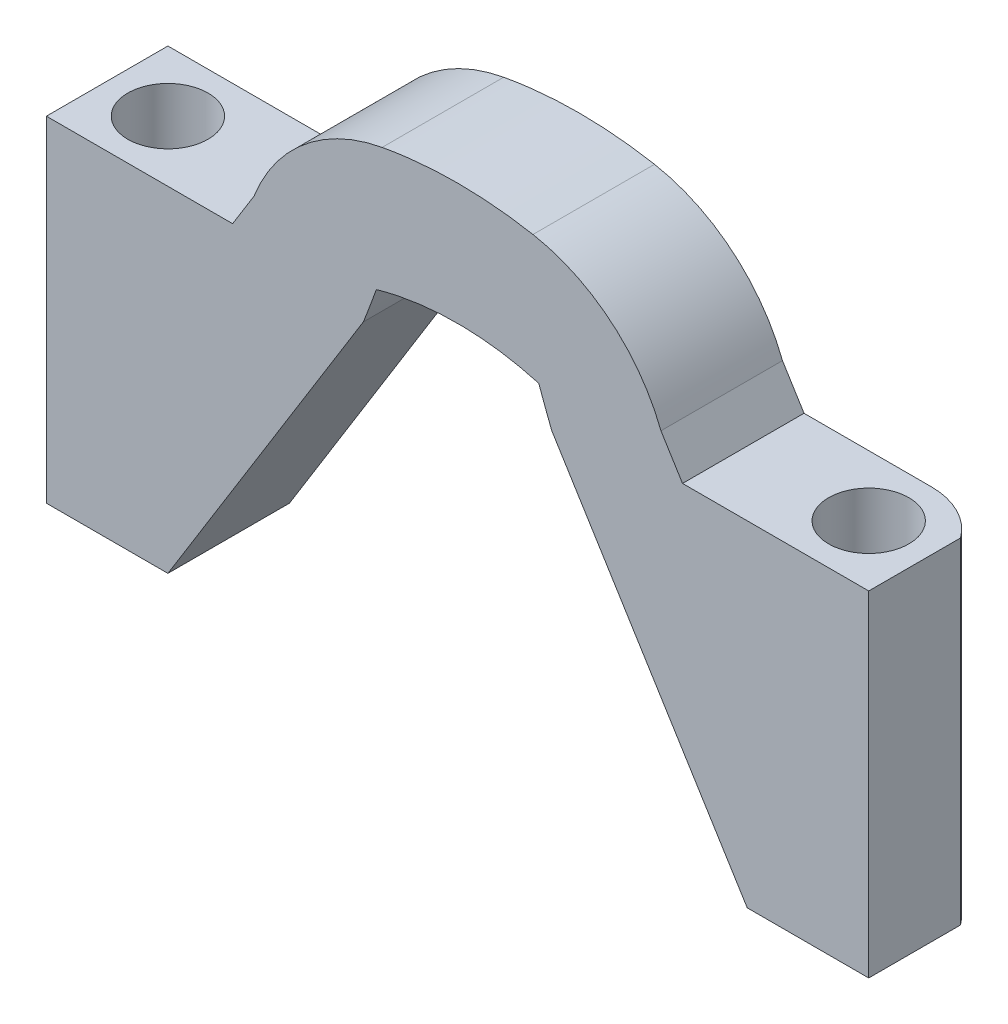
ISO-10303-21;
HEADER;
FILE_DESCRIPTION(('STEP AP214'),'2;1');
FILE_NAME('part.step','',(''),(''),'','','');
FILE_SCHEMA(('AUTOMOTIVE_DESIGN { 1 0 10303 214 1 1 1 1 }'));
ENDSEC;
DATA;
#1=APPLICATION_CONTEXT('core data for automotive mechanical design processes');
#2=APPLICATION_PROTOCOL_DEFINITION('international standard','automotive_design',2000,#1);
#3=PRODUCT_CONTEXT('',#1,'mechanical');
#4=PRODUCT('Part','Part','',(#3));
#5=PRODUCT_RELATED_PRODUCT_CATEGORY('part','',(#4));
#6=PRODUCT_DEFINITION_FORMATION('','',#4);
#7=PRODUCT_DEFINITION_CONTEXT('part definition',#1,'design');
#8=PRODUCT_DEFINITION('design','',#6,#7);
#9=PRODUCT_DEFINITION_SHAPE('','',#8);
#10=(LENGTH_UNIT() NAMED_UNIT(*) SI_UNIT(.MILLI.,.METRE.));
#11=(NAMED_UNIT(*) PLANE_ANGLE_UNIT() SI_UNIT($,.RADIAN.));
#12=(NAMED_UNIT(*) SI_UNIT($,.STERADIAN.) SOLID_ANGLE_UNIT());
#13=UNCERTAINTY_MEASURE_WITH_UNIT(LENGTH_MEASURE(1.E-05),#10,'distance_accuracy_value','');
#14=(GEOMETRIC_REPRESENTATION_CONTEXT(3) GLOBAL_UNCERTAINTY_ASSIGNED_CONTEXT((#13)) GLOBAL_UNIT_ASSIGNED_CONTEXT((#10,
#11,#12)) REPRESENTATION_CONTEXT('',''));
#15=CARTESIAN_POINT('',(0.,0.,0.));
#16=DIRECTION('',(0.,0.,1.));
#17=DIRECTION('',(1.,0.,0.));
#18=AXIS2_PLACEMENT_3D('',#15,#16,#17);
#19=CARTESIAN_POINT('',(15.520816454,38.340282351,6.988801204));
#20=DIRECTION('',(0.,0.,1.));
#21=DIRECTION('',(1.,0.,0.));
#22=AXIS2_PLACEMENT_3D('',#19,#20,#21);
#23=CYLINDRICAL_SURFACE('',#22,7.);
#24=CARTESIAN_POINT('',(15.520816454,38.340282351,4.488801204));
#25=DIRECTION('',(0.,0.,-1.));
#26=DIRECTION('',(1.,0.,0.));
#27=AXIS2_PLACEMENT_3D('',#24,#25,#26);
#28=CIRCLE('',#27,7.);
#29=CARTESIAN_POINT('',(16.785029478,45.225176354,4.488801204));
#30=VERTEX_POINT('',#29);
#31=CARTESIAN_POINT('',(22.050755304,40.862166293,4.488801204));
#32=VERTEX_POINT('',#31);
#33=EDGE_CURVE('E219',#30,#32,#28,.T.);
#34=ORIENTED_EDGE('',*,*,#33,.F.);
#35=DIRECTION('',(0.,0.,-1.));
#36=VECTOR('',#35,1.);
#37=CARTESIAN_POINT('',(16.785029478,45.225176354,9.488801204));
#38=LINE('',#37,#36);
#39=CARTESIAN_POINT('',(16.785029478,45.225176354,9.488801204));
#40=VERTEX_POINT('',#39);
#41=EDGE_CURVE('E64',#40,#30,#38,.T.);
#42=ORIENTED_EDGE('',*,*,#41,.F.);
#43=CARTESIAN_POINT('',(15.520816454,38.340282351,9.488801204));
#44=DIRECTION('',(0.,0.,1.));
#45=DIRECTION('',(1.,0.,0.));
#46=AXIS2_PLACEMENT_3D('',#43,#44,#45);
#47=CIRCLE('',#46,7.);
#48=CARTESIAN_POINT('',(22.050755304,40.862166293,9.488801204));
#49=VERTEX_POINT('',#48);
#50=EDGE_CURVE('E216',#49,#40,#47,.T.);
#51=ORIENTED_EDGE('',*,*,#50,.F.);
#52=DIRECTION('',(0.,0.,1.));
#53=VECTOR('',#52,1.);
#54=CARTESIAN_POINT('',(22.050755304,40.862166293,4.488801204));
#55=LINE('',#54,#53);
#56=EDGE_CURVE('E11',#32,#49,#55,.T.);
#57=ORIENTED_EDGE('',*,*,#56,.F.);
#58=EDGE_LOOP('',(#34,#42,#51,#57));
#59=FACE_BOUND('',#58,.T.);
#60=ADVANCED_FACE('F55',(#59),#23,.T.);
#61=CARTESIAN_POINT('',(11.84217956,38.340282284,6.988801204));
#62=DIRECTION('',(0.,0.,1.));
#63=DIRECTION('',(1.,0.,0.));
#64=AXIS2_PLACEMENT_3D('',#61,#62,#63);
#65=CYLINDRICAL_SURFACE('',#64,7.);
#66=CARTESIAN_POINT('',(11.84217956,38.340282284,4.488801204));
#67=DIRECTION('',(0.,0.,-1.));
#68=DIRECTION('',(1.,0.,0.));
#69=AXIS2_PLACEMENT_3D('',#66,#67,#68);
#70=CIRCLE('',#69,7.);
#71=CARTESIAN_POINT('',(5.31227635,40.862258507,4.488801204));
#72=VERTEX_POINT('',#71);
#73=CARTESIAN_POINT('',(10.577966277,45.225176239,4.488801204));
#74=VERTEX_POINT('',#73);
#75=EDGE_CURVE('E312',#72,#74,#70,.T.);
#76=ORIENTED_EDGE('',*,*,#75,.F.);
#77=DIRECTION('',(0.,0.,1.));
#78=VECTOR('',#77,1.);
#79=CARTESIAN_POINT('',(5.31227635,40.862258507,4.488801204));
#80=LINE('',#79,#78);
#81=CARTESIAN_POINT('',(5.31227635,40.862258507,9.488801204));
#82=VERTEX_POINT('',#81);
#83=EDGE_CURVE('E337',#72,#82,#80,.T.);
#84=ORIENTED_EDGE('',*,*,#83,.T.);
#85=CARTESIAN_POINT('',(11.84217956,38.340282284,9.488801204));
#86=DIRECTION('',(0.,0.,1.));
#87=DIRECTION('',(1.,0.,0.));
#88=AXIS2_PLACEMENT_3D('',#85,#86,#87);
#89=CIRCLE('',#88,7.);
#90=CARTESIAN_POINT('',(10.577966277,45.225176239,9.488801204));
#91=VERTEX_POINT('',#90);
#92=EDGE_CURVE('E241',#91,#82,#89,.T.);
#93=ORIENTED_EDGE('',*,*,#92,.F.);
#94=DIRECTION('',(0.,0.,1.));
#95=VECTOR('',#94,1.);
#96=CARTESIAN_POINT('',(10.577966277,45.225176239,4.488801204));
#97=LINE('',#96,#95);
#98=EDGE_CURVE('E225',#74,#91,#97,.T.);
#99=ORIENTED_EDGE('',*,*,#98,.F.);
#100=EDGE_LOOP('',(#76,#84,#93,#99));
#101=FACE_BOUND('',#100,.T.);
#102=ADVANCED_FACE('F505',(#101),#65,.T.);
#103=CARTESIAN_POINT('',(22.494258966,40.146225993,-0.511198796));
#104=DIRECTION('',(-0.85010434363712,-0.526614284775206,0.));
#105=DIRECTION('',(-0.526614284775206,0.85010434363712,0.));
#106=AXIS2_PLACEMENT_3D('',#103,#104,#105);
#107=PLANE('',#106);
#108=ORIENTED_EDGE('',*,*,#56,.T.);
#109=DIRECTION('',(0.526614284775206,-0.85010434363712,0.));
#110=VECTOR('',#109,1.);
#111=CARTESIAN_POINT('',(22.050755304,40.862166293,9.488801204));
#112=LINE('',#111,#110);
#113=CARTESIAN_POINT('',(22.937762628,39.430285692,9.488801204));
#114=VERTEX_POINT('',#113);
#115=EDGE_CURVE('E234',#49,#114,#112,.T.);
#116=ORIENTED_EDGE('',*,*,#115,.T.);
#117=DIRECTION('',(0.,0.,1.));
#118=VECTOR('',#117,1.);
#119=CARTESIAN_POINT('',(22.937762628,39.430285692,4.488801204));
#120=LINE('',#119,#118);
#121=CARTESIAN_POINT('',(22.937762628,39.430285692,4.488801204));
#122=VERTEX_POINT('',#121);
#123=EDGE_CURVE('E338',#122,#114,#120,.T.);
#124=ORIENTED_EDGE('',*,*,#123,.F.);
#125=DIRECTION('',(0.526614284775206,-0.85010434363712,0.));
#126=VECTOR('',#125,1.);
#127=CARTESIAN_POINT('',(22.050755304,40.862166293,4.488801204));
#128=LINE('',#127,#126);
#129=EDGE_CURVE('E313',#32,#122,#128,.T.);
#130=ORIENTED_EDGE('',*,*,#129,.F.);
#131=EDGE_LOOP('',(#108,#116,#124,#130));
#132=FACE_BOUND('',#131,.T.);
#133=ADVANCED_FACE('F498',(#132),#107,.F.);
#134=CARTESIAN_POINT('',(16.785029478,45.225176354,4.488801204));
#135=CARTESIAN_POINT('',(16.785029478,45.225176354,9.488801204));
#136=CARTESIAN_POINT('',(16.468142402,45.283363563,4.488801204));
#137=CARTESIAN_POINT('',(16.468142402,45.283363563,9.488801204));
#138=CARTESIAN_POINT('',(15.797495063,45.386800618,4.488801204));
#139=CARTESIAN_POINT('',(15.797495063,45.386800618,9.488801204));
#140=CARTESIAN_POINT('',(14.75986623,45.48476329,4.488801204));
#141=CARTESIAN_POINT('',(14.75986623,45.48476329,9.488801204));
#142=CARTESIAN_POINT('',(13.681498191,45.518517114,4.488801204));
#143=CARTESIAN_POINT('',(13.681498191,45.518517114,9.488801204));
#144=CARTESIAN_POINT('',(12.603130152,45.48476329,4.488801204));
#145=CARTESIAN_POINT('',(12.603130152,45.48476329,9.488801204));
#146=CARTESIAN_POINT('',(11.565501105,45.386800597,4.488801204));
#147=CARTESIAN_POINT('',(11.565501105,45.386800597,9.488801204));
#148=CARTESIAN_POINT('',(10.894853557,45.283363498,4.488801204));
#149=CARTESIAN_POINT('',(10.894853557,45.283363498,9.488801204));
#150=CARTESIAN_POINT('',(10.577966273,45.225176238,4.488801204));
#151=CARTESIAN_POINT('',(10.577966273,45.225176238,9.488801204));
#152=(BOUNDED_SURFACE() B_SPLINE_SURFACE(3,1,((#134,#135),(#136,#137),(#138,#139),(#140,#141),
(#142,#143),(#144,#145),(#146,#147),(#148,#149),(#150,#151)),.UNSPECIFIED.,.F.,.F.,
.F.) B_SPLINE_SURFACE_WITH_KNOTS((4,1,1,1,1,1,4),(2,2),(0.174149348,0.275401242,0.387700621,0.5,
0.612299379,0.724598758,0.82585072),(0.5,1.),
.UNSPECIFIED.) GEOMETRIC_REPRESENTATION_ITEM() RATIONAL_B_SPLINE_SURFACE(((1.,1.),(1.,1.),(1.,
1.),(1.,1.),(1.,1.),(1.,1.),(1.,1.),(1.,1.),(1.,1.))) REPRESENTATION_ITEM('') SURFACE());
#153=CARTESIAN_POINT('',(16.785029478,45.225176354,4.488801204));
#154=CARTESIAN_POINT('',(16.468142402,45.283363563,4.488801204));
#155=CARTESIAN_POINT('',(15.797495063,45.386800618,4.488801204));
#156=CARTESIAN_POINT('',(14.75986623,45.48476329,4.488801204));
#157=CARTESIAN_POINT('',(13.681498191,45.518517114,4.488801204));
#158=CARTESIAN_POINT('',(12.603130152,45.48476329,4.488801204));
#159=CARTESIAN_POINT('',(11.565501105,45.386800597,4.488801204));
#160=CARTESIAN_POINT('',(10.894853557,45.283363498,4.488801204));
#161=CARTESIAN_POINT('',(10.577966273,45.225176238,4.488801204));
#162=(BOUNDED_CURVE() B_SPLINE_CURVE(3,(#153,#154,#155,#156,#157,#158,#159,#160,#161),
.UNSPECIFIED.,.F.,.F.) B_SPLINE_CURVE_WITH_KNOTS((4,1,1,1,1,1,4),(0.174149348,0.275401242,
0.387700621,0.5,0.612299379,0.724598758,0.82585072),
.UNSPECIFIED.) CURVE() GEOMETRIC_REPRESENTATION_ITEM() RATIONAL_B_SPLINE_CURVE((1.,1.,1.,1.,1.,
1.,1.,1.,1.)) REPRESENTATION_ITEM(''));
#163=EDGE_CURVE('E479',#30,#74,#162,.T.);
#164=CARTESIAN_POINT('',(16.785029478,45.225176354,9.488801204));
#165=CARTESIAN_POINT('',(16.468142402,45.283363563,9.488801204));
#166=CARTESIAN_POINT('',(15.797495063,45.386800618,9.488801204));
#167=CARTESIAN_POINT('',(14.75986623,45.48476329,9.488801204));
#168=CARTESIAN_POINT('',(13.681498191,45.518517114,9.488801204));
#169=CARTESIAN_POINT('',(12.603130152,45.48476329,9.488801204));
#170=CARTESIAN_POINT('',(11.565501106,45.386800598,9.488801204));
#171=CARTESIAN_POINT('',(10.89485356,45.283363499,9.488801204));
#172=CARTESIAN_POINT('',(10.577966277,45.225176239,9.488801204));
#173=(BOUNDED_CURVE() B_SPLINE_CURVE(3,(#164,#165,#166,#167,#168,#169,#170,#171,#172),
.UNSPECIFIED.,.F.,.F.) B_SPLINE_CURVE_WITH_KNOTS((4,1,1,1,1,1,4),(0.174149348,0.275401242,
0.387700621,0.5,0.612299379,0.724598758,0.825850719),
.UNSPECIFIED.) CURVE() GEOMETRIC_REPRESENTATION_ITEM() RATIONAL_B_SPLINE_CURVE((1.,1.,1.,1.,1.,
1.,1.,1.,1.)) REPRESENTATION_ITEM(''));
#174=EDGE_CURVE('E231',#40,#91,#173,.T.);
#175=ORIENTED_EDGE('',*,*,#163,.T.);
#176=ORIENTED_EDGE('',*,*,#98,.T.);
#177=ORIENTED_EDGE('',*,*,#174,.F.);
#178=ORIENTED_EDGE('',*,*,#41,.T.);
#179=EDGE_LOOP('',(#175,#176,#177,#178));
#180=FACE_BOUND('',#179,.T.);
#181=ADVANCED_FACE('F238',(#180),#152,.T.);
#182=CARTESIAN_POINT('',(4.868745369,40.1462721,-0.511198796));
#183=DIRECTION('',(-0.85010500389315,0.52661321893381,0.));
#184=DIRECTION('',(0.,0.,1.));
#185=AXIS2_PLACEMENT_3D('',#182,#183,#184);
#186=PLANE('',#185);
#187=DIRECTION('',(-0.52661321893381,-0.85010500389315,0.));
#188=VECTOR('',#187,1.);
#189=CARTESIAN_POINT('',(5.31227635,40.862258507,4.488801204));
#190=LINE('',#189,#188);
#191=CARTESIAN_POINT('',(4.425214387,39.430285692,4.488801204));
#192=VERTEX_POINT('',#191);
#193=EDGE_CURVE('E308',#72,#192,#190,.T.);
#194=ORIENTED_EDGE('',*,*,#193,.T.);
#195=DIRECTION('',(0.,0.,1.));
#196=VECTOR('',#195,1.);
#197=CARTESIAN_POINT('',(4.425214387,39.430285692,4.488801204));
#198=LINE('',#197,#196);
#199=CARTESIAN_POINT('',(4.425214387,39.430285692,9.488801204));
#200=VERTEX_POINT('',#199);
#201=EDGE_CURVE('E334',#192,#200,#198,.T.);
#202=ORIENTED_EDGE('',*,*,#201,.T.);
#203=DIRECTION('',(-0.52661321893381,-0.85010500389315,0.));
#204=VECTOR('',#203,1.);
#205=CARTESIAN_POINT('',(5.31227635,40.862258507,9.488801204));
#206=LINE('',#205,#204);
#207=EDGE_CURVE('E246',#82,#200,#206,.T.);
#208=ORIENTED_EDGE('',*,*,#207,.F.);
#209=ORIENTED_EDGE('',*,*,#83,.F.);
#210=EDGE_LOOP('',(#194,#202,#208,#209));
#211=FACE_BOUND('',#210,.T.);
#212=ADVANCED_FACE('F497',(#211),#186,.T.);
#213=CARTESIAN_POINT('',(0.262885395,39.430285692,-4.511198796));
#214=DIRECTION('',(0.,1.,0.));
#215=DIRECTION('',(1.,0.,0.));
#216=AXIS2_PLACEMENT_3D('',#213,#214,#215);
#217=PLANE('',#216);
#218=CARTESIAN_POINT('',(-0.737114605,39.430285692,6.988801204));
#219=DIRECTION('',(0.,1.,0.));
#220=DIRECTION('',(0.,0.,1.));
#221=AXIS2_PLACEMENT_3D('',#218,#219,#220);
#222=CIRCLE('',#221,1.65);
#223=CARTESIAN_POINT('',(-0.737114605,39.430285692,8.638801204));
#224=VERTEX_POINT('',#223);
#225=EDGE_CURVE('E603',#224,#224,#222,.T.);
#226=ORIENTED_EDGE('',*,*,#225,.F.);
#227=EDGE_LOOP('',(#226));
#228=FACE_BOUND('',#227,.T.);
#229=DIRECTION('',(-1.,0.,0.));
#230=VECTOR('',#229,1.);
#231=CARTESIAN_POINT('',(4.425214387,39.430285692,4.488801204));
#232=LINE('',#231,#230);
#233=CARTESIAN_POINT('',(-3.237114605,39.430285692,4.488801204));
#234=VERTEX_POINT('',#233);
#235=EDGE_CURVE('E347',#192,#234,#232,.T.);
#236=ORIENTED_EDGE('',*,*,#235,.T.);
#237=DIRECTION('',(0.,0.,1.));
#238=VECTOR('',#237,1.);
#239=CARTESIAN_POINT('',(-3.237114605,39.430285692,4.488801204));
#240=LINE('',#239,#238);
#241=CARTESIAN_POINT('',(-3.237114605,39.430285692,9.488801204));
#242=VERTEX_POINT('',#241);
#243=EDGE_CURVE('E236',#234,#242,#240,.T.);
#244=ORIENTED_EDGE('',*,*,#243,.T.);
#245=DIRECTION('',(-1.,0.,0.));
#246=VECTOR('',#245,1.);
#247=CARTESIAN_POINT('',(4.425214387,39.430285692,9.488801204));
#248=LINE('',#247,#246);
#249=EDGE_CURVE('E265',#200,#242,#248,.T.);
#250=ORIENTED_EDGE('',*,*,#249,.F.);
#251=ORIENTED_EDGE('',*,*,#201,.F.);
#252=EDGE_LOOP('',(#236,#244,#250,#251));
#253=FACE_BOUND('',#252,.T.);
#254=ADVANCED_FACE('F525',(#228,#253),#217,.T.);
#255=CARTESIAN_POINT('',(27.100110987,39.430285692,-4.511198796));
#256=DIRECTION('',(0.,-1.,0.));
#257=DIRECTION('',(0.,0.,-1.));
#258=AXIS2_PLACEMENT_3D('',#255,#256,#257);
#259=PLANE('',#258);
#260=CARTESIAN_POINT('',(28.100110987,39.430285692,6.988801204));
#261=DIRECTION('',(0.,1.,0.));
#262=DIRECTION('',(0.,0.,1.));
#263=AXIS2_PLACEMENT_3D('',#260,#261,#262);
#264=CIRCLE('',#263,1.65);
#265=CARTESIAN_POINT('',(28.100110987,39.430285692,8.638801204));
#266=VERTEX_POINT('',#265);
#267=EDGE_CURVE('E253',#266,#266,#264,.T.);
#268=ORIENTED_EDGE('',*,*,#267,.F.);
#269=EDGE_LOOP('',(#268));
#270=FACE_BOUND('',#269,.T.);
#271=DIRECTION('',(1.,0.,0.));
#272=VECTOR('',#271,1.);
#273=CARTESIAN_POINT('',(22.937762628,39.430285692,4.488801204));
#274=LINE('',#273,#272);
#275=CARTESIAN_POINT('',(28.181498191,39.430285692,4.488801204));
#276=VERTEX_POINT('',#275);
#277=EDGE_CURVE('E317',#122,#276,#274,.T.);
#278=ORIENTED_EDGE('',*,*,#277,.F.);
#279=ORIENTED_EDGE('',*,*,#123,.T.);
#280=DIRECTION('',(1.,0.,0.));
#281=VECTOR('',#280,1.);
#282=CARTESIAN_POINT('',(22.937762628,39.430285692,9.488801204));
#283=LINE('',#282,#281);
#284=CARTESIAN_POINT('',(30.600110987,39.430285692,9.488801204));
#285=VERTEX_POINT('',#284);
#286=EDGE_CURVE('E261',#114,#285,#283,.T.);
#287=ORIENTED_EDGE('',*,*,#286,.T.);
#288=DIRECTION('',(0.,0.,1.));
#289=VECTOR('',#288,1.);
#290=CARTESIAN_POINT('',(30.600110987,39.430285692,5.713889336));
#291=LINE('',#290,#289);
#292=CARTESIAN_POINT('',(30.600110987,39.430285692,5.713889336));
#293=VERTEX_POINT('',#292);
#294=EDGE_CURVE('E353',#293,#285,#291,.T.);
#295=ORIENTED_EDGE('',*,*,#294,.F.);
#296=CARTESIAN_POINT('',(28.181498191,39.430285692,7.488801204));
#297=DIRECTION('',(0.,1.,0.));
#298=DIRECTION('',(0.,0.,-1.));
#299=AXIS2_PLACEMENT_3D('',#296,#297,#298);
#300=CIRCLE('',#299,3.);
#301=EDGE_CURVE('E86',#293,#276,#300,.T.);
#302=ORIENTED_EDGE('',*,*,#301,.T.);
#303=EDGE_LOOP('',(#278,#279,#287,#295,#302));
#304=FACE_BOUND('',#303,.T.);
#305=ADVANCED_FACE('F451',(#270,#304),#259,.F.);
#306=CARTESIAN_POINT('',(28.181498191,51.637887516,7.488801204));
#307=DIRECTION('',(0.,-1.,0.));
#308=DIRECTION('',(0.,0.,-1.));
#309=AXIS2_PLACEMENT_3D('',#306,#307,#308);
#310=CYLINDRICAL_SURFACE('',#309,3.);
#311=ORIENTED_EDGE('',*,*,#301,.F.);
#312=DIRECTION('',(0.,-1.,0.));
#313=VECTOR('',#312,1.);
#314=CARTESIAN_POINT('',(30.600110987,39.430285692,5.713889336));
#315=LINE('',#314,#313);
#316=CARTESIAN_POINT('',(30.600110987,25.637887516,5.713889336));
#317=VERTEX_POINT('',#316);
#318=EDGE_CURVE('E350',#293,#317,#315,.T.);
#319=ORIENTED_EDGE('',*,*,#318,.T.);
#320=CARTESIAN_POINT('',(28.181498191,25.637887516,7.488801204));
#321=DIRECTION('',(0.,-1.,0.));
#322=DIRECTION('',(0.,0.,-1.));
#323=AXIS2_PLACEMENT_3D('',#320,#321,#322);
#324=CIRCLE('',#323,3.);
#325=CARTESIAN_POINT('',(28.181498191,25.637887516,4.488801204));
#326=VERTEX_POINT('',#325);
#327=EDGE_CURVE('E76',#326,#317,#324,.T.);
#328=ORIENTED_EDGE('',*,*,#327,.F.);
#329=DIRECTION('',(0.,-1.,0.));
#330=VECTOR('',#329,1.);
#331=CARTESIAN_POINT('',(28.181498191,39.430285692,4.488801204));
#332=LINE('',#331,#330);
#333=EDGE_CURVE('E321',#276,#326,#332,.T.);
#334=ORIENTED_EDGE('',*,*,#333,.F.);
#335=EDGE_LOOP('',(#311,#319,#328,#334));
#336=FACE_BOUND('',#335,.T.);
#337=ADVANCED_FACE('F617',(#336),#310,.T.);
#338=CARTESIAN_POINT('',(21.578707997,32.129568897,-2.711198796));
#339=DIRECTION('',(-0.85010434363712,-0.526614284775206,0.));
#340=DIRECTION('',(-0.526614284775206,0.85010434363712,0.));
#341=AXIS2_PLACEMENT_3D('',#338,#339,#340);
#342=PLANE('',#341);
#343=DIRECTION('',(0.526614284775206,-0.85010434363712,0.));
#344=VECTOR('',#343,1.);
#345=CARTESIAN_POINT('',(17.557305007,38.621250278,4.488801204));
#346=LINE('',#345,#344);
#347=CARTESIAN_POINT('',(17.557305007,38.621250278,4.488801204));
#348=VERTEX_POINT('',#347);
#349=CARTESIAN_POINT('',(25.600110987,25.637887516,4.488801204));
#350=VERTEX_POINT('',#349);
#351=EDGE_CURVE('E329',#348,#350,#346,.T.);
#352=ORIENTED_EDGE('',*,*,#351,.T.);
#353=DIRECTION('',(0.,0.,1.));
#354=VECTOR('',#353,1.);
#355=CARTESIAN_POINT('',(25.600110987,25.637887516,4.488801204));
#356=LINE('',#355,#354);
#357=CARTESIAN_POINT('',(25.600110987,25.637887516,9.488801204));
#358=VERTEX_POINT('',#357);
#359=EDGE_CURVE('E364',#350,#358,#356,.T.);
#360=ORIENTED_EDGE('',*,*,#359,.T.);
#361=DIRECTION('',(0.526614284775206,-0.850104343637119,0.));
#362=VECTOR('',#361,1.);
#363=CARTESIAN_POINT('',(17.55729864,38.621260556,9.488801204));
#364=LINE('',#363,#362);
#365=CARTESIAN_POINT('',(17.5573005,38.621261708,9.488801204));
#366=VERTEX_POINT('',#365);
#367=EDGE_CURVE('E295',#366,#358,#364,.T.);
#368=ORIENTED_EDGE('',*,*,#367,.F.);
#369=DIRECTION('',(0.,0.,1.));
#370=VECTOR('',#369,1.);
#371=CARTESIAN_POINT('',(17.557305007,38.621250278,4.488801204));
#372=LINE('',#371,#370);
#373=EDGE_CURVE('E369',#348,#366,#372,.T.);
#374=ORIENTED_EDGE('',*,*,#373,.F.);
#375=EDGE_LOOP('',(#352,#360,#368,#374));
#376=FACE_BOUND('',#375,.T.);
#377=ADVANCED_FACE('F417',(#376),#342,.T.);
#378=CARTESIAN_POINT('',(5.784308116,32.129618935,-2.711198796));
#379=DIRECTION('',(-0.85010500389315,0.52661321893381,0.));
#380=DIRECTION('',(0.,0.,1.));
#381=AXIS2_PLACEMENT_3D('',#378,#379,#380);
#382=PLANE('',#381);
#383=DIRECTION('',(0.,0.,1.));
#384=VECTOR('',#383,1.);
#385=CARTESIAN_POINT('',(9.805730837,38.621350355,4.488801204));
#386=LINE('',#385,#384);
#387=CARTESIAN_POINT('',(9.805730837,38.621350355,4.488801204));
#388=VERTEX_POINT('',#387);
#389=CARTESIAN_POINT('',(9.805730837,38.621350355,9.488801204));
#390=VERTEX_POINT('',#389);
#391=EDGE_CURVE('E287',#388,#390,#386,.T.);
#392=ORIENTED_EDGE('',*,*,#391,.T.);
#393=DIRECTION('',(-0.52661321893381,-0.85010500389315,0.));
#394=VECTOR('',#393,1.);
#395=CARTESIAN_POINT('',(9.805730837,38.621350355,9.488801204));
#396=LINE('',#395,#394);
#397=CARTESIAN_POINT('',(1.762885395,25.637887516,9.488801204));
#398=VERTEX_POINT('',#397);
#399=EDGE_CURVE('E274',#390,#398,#396,.T.);
#400=ORIENTED_EDGE('',*,*,#399,.T.);
#401=DIRECTION('',(0.,0.,1.));
#402=VECTOR('',#401,1.);
#403=CARTESIAN_POINT('',(1.762885395,25.637887516,4.488801204));
#404=LINE('',#403,#402);
#405=CARTESIAN_POINT('',(1.762885395,25.637887516,4.488801204));
#406=VERTEX_POINT('',#405);
#407=EDGE_CURVE('E359',#406,#398,#404,.T.);
#408=ORIENTED_EDGE('',*,*,#407,.F.);
#409=DIRECTION('',(-0.52661321893381,-0.85010500389315,0.));
#410=VECTOR('',#409,1.);
#411=CARTESIAN_POINT('',(9.805730837,38.621350355,4.488801204));
#412=LINE('',#411,#410);
#413=EDGE_CURVE('E339',#388,#406,#412,.T.);
#414=ORIENTED_EDGE('',*,*,#413,.F.);
#415=EDGE_LOOP('',(#392,#400,#408,#414));
#416=FACE_BOUND('',#415,.T.);
#417=ADVANCED_FACE('F450',(#416),#382,.F.);
#418=CARTESIAN_POINT('',(17.023476229,40.041055037,9.488801204));
#419=CARTESIAN_POINT('',(14.824584972,40.666728109,9.488801204));
#420=CARTESIAN_POINT('',(12.53841141,40.666728109,9.488801204));
#421=CARTESIAN_POINT('',(10.339520153,40.041055037,9.488801204));
#422=CARTESIAN_POINT('',(17.023611976,40.041532114,9.473908645));
#423=CARTESIAN_POINT('',(14.824631403,40.6672306,9.473908645));
#424=CARTESIAN_POINT('',(12.538364979,40.6672306,9.473908645));
#425=CARTESIAN_POINT('',(10.339384405,40.041532114,9.473908645));
#426=CARTESIAN_POINT('',(17.039641207,40.097865906,7.70873212));
#427=CARTESIAN_POINT('',(14.830114025,40.726565327,7.70873212));
#428=CARTESIAN_POINT('',(12.532882357,40.726565327,7.70873212));
#429=CARTESIAN_POINT('',(10.323355174,40.097865906,7.70873212));
#430=CARTESIAN_POINT('',(17.047647237,40.126002628,6.036079841));
#431=CARTESIAN_POINT('',(14.832852399,40.756200909,6.036079841));
#432=CARTESIAN_POINT('',(12.530143983,40.756200909,6.036079841));
#433=CARTESIAN_POINT('',(10.315349144,40.126002628,6.036079841));
#434=CARTESIAN_POINT('',(17.04906419,40.130982425,4.48880109));
#435=CARTESIAN_POINT('',(14.833337052,40.761445983,4.48880109));
#436=CARTESIAN_POINT('',(12.52965933,40.761445983,4.48880109));
#437=CARTESIAN_POINT('',(10.313932191,40.130982425,4.48880109));
#438=(BOUNDED_SURFACE() B_SPLINE_SURFACE(3,3,((#418,#419,#420,#421),(#422,#423,#424,#425),(#426,
#427,#428,#429),(#430,#431,#432,#433),(#434,#435,#436,#437)),.UNSPECIFIED.,.F.,.F.,
.F.) B_SPLINE_SURFACE_WITH_KNOTS((4,1,4),(4,4),(0.405726384,0.406727036,0.524383554),
(0.165558331,0.834441669),
.UNSPECIFIED.) GEOMETRIC_REPRESENTATION_ITEM() RATIONAL_B_SPLINE_SURFACE(((0.976965826,
0.952099872,0.952099872,0.976965826),(0.976965826,0.952099872,0.952099872,0.976965826),
(0.976965826,0.952099872,0.952099872,0.976965826),(0.976965826,0.952099872,0.952099872,
0.976965826),(0.976965826,0.952099872,0.952099872,0.976965826))) REPRESENTATION_ITEM('') SURFACE());
#439=CARTESIAN_POINT('',(16.9849825000978,40.149028999351,4.48880120400121));
#440=CARTESIAN_POINT('',(16.9852625867054,40.1482402883393,4.6932212591399));
#441=CARTESIAN_POINT('',(16.985708992579,40.146981270749,4.89763915254858));
#442=CARTESIAN_POINT('',(16.9869324374271,40.1435315996862,5.30798371316629));
#443=CARTESIAN_POINT('',(16.9877119062339,40.1413340996591,5.51391031572807));
#444=CARTESIAN_POINT('',(16.9896011664374,40.1360117608414,5.92706902603369));
#445=CARTESIAN_POINT('',(16.9907130413306,40.1328810732778,6.13430104860999));
#446=CARTESIAN_POINT('',(16.9932666163034,40.1256968267382,6.54987419005043));
#447=CARTESIAN_POINT('',(16.9947100768463,40.1216383424558,6.75821521283321));
#448=CARTESIAN_POINT('',(16.997925775739,40.1126042585676,7.17581655294165));
#449=CARTESIAN_POINT('',(16.9996994699804,40.1076245984513,7.38507677110547));
#450=CARTESIAN_POINT('',(17.0035741550052,40.0967548106068,7.80433319135611));
#451=CARTESIAN_POINT('',(17.0056763142396,40.0908614331081,8.01432929832603));
#452=CARTESIAN_POINT('',(17.0102059472606,40.0781719559837,8.4348805191116));
#453=CARTESIAN_POINT('',(17.0126343172673,40.0713733698912,8.645435548188));
#454=CARTESIAN_POINT('',(17.01781408156,40.0568816482037,9.06693385524011));
#455=CARTESIAN_POINT('',(17.0205661141561,40.0491867452369,9.27787706462347));
#456=CARTESIAN_POINT('',(17.023476229,40.041055037,9.488801204));
#457=B_SPLINE_CURVE_WITH_KNOTS('',3,(#439,#440,#441,#442,#443,#444,#445,#446,#447,#448,#449,
#450,#451,#452,#453,#454,#455,#456),.UNSPECIFIED.,.F.,.F.,(4,2,2,2,2,2,2,2,4),(0.,
0.613264523532079,1.23108157457932,1.85285527553348,2.4780097005481,3.10598845003212,
3.73625422521628,4.36828840362394,5.00159063451336),.UNSPECIFIED.);
#458=CARTESIAN_POINT('',(17.023476229,40.041055037,9.488801204));
#459=VERTEX_POINT('',#458);
#460=CARTESIAN_POINT('',(16.9849825,40.149028999,4.488801204));
#461=VERTEX_POINT('',#460);
#462=EDGE_CURVE('E290',#459,#461,#457,.F.);
#463=CARTESIAN_POINT('',(17.0234762417802,40.0410550819153,9.48879980191225));
#464=CARTESIAN_POINT('',(14.8245849763713,40.6667281563079,9.48879980191226));
#465=CARTESIAN_POINT('',(12.5384114056287,40.6667281563079,9.48879980191226));
#466=CARTESIAN_POINT('',(10.3395201402198,40.0410550819153,9.48879980191225));
#467=(BOUNDED_CURVE() B_SPLINE_CURVE(3,(#463,#464,#465,#466),.UNSPECIFIED.,.F.,
.F.) B_SPLINE_CURVE_WITH_KNOTS((4,4),(0.165558331,0.834441669),
.UNSPECIFIED.) CURVE() GEOMETRIC_REPRESENTATION_ITEM() RATIONAL_B_SPLINE_CURVE((0.976965826,
0.952099872,0.952099872,0.976965826)) REPRESENTATION_ITEM(''));
#468=CARTESIAN_POINT('',(10.339520153,40.041055037,9.488801204));
#469=VERTEX_POINT('',#468);
#470=EDGE_CURVE('E386',#459,#469,#467,.T.);
#471=CARTESIAN_POINT('',(10.339520153,40.041055037,9.488801204));
#472=CARTESIAN_POINT('',(10.3424302635501,40.0491867564954,9.2778767094496));
#473=CARTESIAN_POINT('',(10.3451822939092,40.0568816698871,9.06693314489701));
#474=CARTESIAN_POINT('',(10.3503620551937,40.0713734066821,8.64543423712989));
#475=CARTESIAN_POINT('',(10.3527904245879,40.0781719979165,8.43487896252543));
#476=CARTESIAN_POINT('',(10.3573200570714,40.0908614807828,8.01432735661385));
#477=CARTESIAN_POINT('',(10.3594222165356,40.0967548593288,7.80433111006112));
#478=CARTESIAN_POINT('',(10.3632969024857,40.1076246459069,7.38507451258582));
#479=CARTESIAN_POINT('',(10.3650705975727,40.1126043041439,7.17581425679276));
#480=CARTESIAN_POINT('',(10.3682862982692,40.1216383820703,6.75821293906226));
#481=CARTESIAN_POINT('',(10.3697297599167,40.1256968626899,6.54987197629686));
#482=CARTESIAN_POINT('',(10.3722833369088,40.1328811008319,6.13429904789865));
#483=CARTESIAN_POINT('',(10.37339521286,40.1360117840647,5.92706717835505));
#484=CARTESIAN_POINT('',(10.3752844746889,40.1413341142494,5.51390886215508));
#485=CARTESIAN_POINT('',(10.3760639442037,40.1435316103603,5.30798250067186));
#486=CARTESIAN_POINT('',(10.3772873896894,40.146981274691,4.8976385049352));
#487=CARTESIAN_POINT('',(10.377733795631,40.1482402898319,4.69322093533248));
#488=CARTESIAN_POINT('',(10.3780138818321,40.1490289996022,4.48880120400207));
#489=B_SPLINE_CURVE_WITH_KNOTS('',3,(#471,#472,#473,#474,#475,#476,#477,#478,#479,#480,#481,
#482,#483,#484,#485,#486,#487,#488),.UNSPECIFIED.,.F.,.F.,(4,2,2,2,2,2,2,2,4),(0.,
0.633303296648133,1.26533821168609,1.89560440552919,2.52358326775488,3.14873751256802,
3.77051075430824,4.38832708205362,5.00159063415208),.UNSPECIFIED.);
#490=CARTESIAN_POINT('',(10.378013882,40.149028999,4.488801204));
#491=VERTEX_POINT('',#490);
#492=EDGE_CURVE('E291',#491,#469,#489,.F.);
#493=CARTESIAN_POINT('',(10.3139321910956,40.1309824246638,4.48880119445356));
#494=CARTESIAN_POINT('',(12.5296593300327,40.7614459826459,4.48880119445356));
#495=CARTESIAN_POINT('',(14.8333370519673,40.7614459826459,4.48880119445356));
#496=CARTESIAN_POINT('',(17.0490641899043,40.1309824246638,4.48880119445356));
#497=(BOUNDED_CURVE() B_SPLINE_CURVE(3,(#493,#494,#495,#496),.UNSPECIFIED.,.F.,
.F.) B_SPLINE_CURVE_WITH_KNOTS((4,4),(0.165558331,0.834441669),
.UNSPECIFIED.) CURVE() GEOMETRIC_REPRESENTATION_ITEM() RATIONAL_B_SPLINE_CURVE((0.976965826,
0.952099872,0.952099872,0.976965826)) REPRESENTATION_ITEM(''));
#498=EDGE_CURVE('E551',#461,#491,#497,.F.);
#499=ORIENTED_EDGE('',*,*,#462,.F.);
#500=ORIENTED_EDGE('',*,*,#470,.T.);
#501=ORIENTED_EDGE('',*,*,#492,.F.);
#502=ORIENTED_EDGE('',*,*,#498,.F.);
#503=EDGE_LOOP('',(#499,#500,#501,#502));
#504=FACE_BOUND('',#503,.T.);
#505=ADVANCED_FACE('F410',(#504),#438,.F.);
#506=CARTESIAN_POINT('',(61.745908101,56.045869545,243.48630234));
#507=DIRECTION('',(0.,0.,-1.));
#508=DIRECTION('',(1.,0.,0.));
#509=AXIS2_PLACEMENT_3D('',#506,#507,#508);
#510=CYLINDRICAL_SURFACE('',#509,47.5);
#511=CARTESIAN_POINT('',(61.745908101,56.045869545,9.488801204));
#512=DIRECTION('',(0.,0.,1.));
#513=DIRECTION('',(1.,0.,0.));
#514=AXIS2_PLACEMENT_3D('',#511,#512,#513);
#515=CIRCLE('',#514,47.5);
#516=EDGE_CURVE('E381',#459,#366,#515,.T.);
#517=ORIENTED_EDGE('',*,*,#516,.F.);
#518=ORIENTED_EDGE('',*,*,#462,.T.);
#519=CARTESIAN_POINT('',(61.745908101,56.045869545,4.488801204));
#520=DIRECTION('',(0.,0.,1.));
#521=DIRECTION('',(1.,0.,0.));
#522=AXIS2_PLACEMENT_3D('',#519,#520,#521);
#523=CIRCLE('',#522,47.5);
#524=EDGE_CURVE('E333',#461,#348,#523,.T.);
#525=ORIENTED_EDGE('',*,*,#524,.T.);
#526=ORIENTED_EDGE('',*,*,#373,.T.);
#527=EDGE_LOOP('',(#517,#518,#525,#526));
#528=FACE_BOUND('',#527,.T.);
#529=ADVANCED_FACE('F399',(#528),#510,.T.);
#530=CARTESIAN_POINT('',(-34.382911719,56.045869545,243.48630234));
#531=DIRECTION('',(0.,0.,-1.));
#532=DIRECTION('',(1.,0.,0.));
#533=AXIS2_PLACEMENT_3D('',#530,#531,#532);
#534=CYLINDRICAL_SURFACE('',#533,47.5);
#535=ORIENTED_EDGE('',*,*,#492,.T.);
#536=CARTESIAN_POINT('',(-34.382911719,56.045869545,9.488801204));
#537=DIRECTION('',(0.,0.,1.));
#538=DIRECTION('',(1.,0.,0.));
#539=AXIS2_PLACEMENT_3D('',#536,#537,#538);
#540=CIRCLE('',#539,47.5);
#541=EDGE_CURVE('E281',#390,#469,#540,.T.);
#542=ORIENTED_EDGE('',*,*,#541,.F.);
#543=ORIENTED_EDGE('',*,*,#391,.F.);
#544=CARTESIAN_POINT('',(-34.382911719,56.045869545,4.488801204));
#545=DIRECTION('',(0.,0.,1.));
#546=DIRECTION('',(1.,0.,0.));
#547=AXIS2_PLACEMENT_3D('',#544,#545,#546);
#548=CIRCLE('',#547,47.5);
#549=EDGE_CURVE('E344',#388,#491,#548,.T.);
#550=ORIENTED_EDGE('',*,*,#549,.T.);
#551=EDGE_LOOP('',(#535,#542,#543,#550));
#552=FACE_BOUND('',#551,.T.);
#553=ADVANCED_FACE('F409',(#552),#534,.T.);
#554=CARTESIAN_POINT('',(13.681498191,25.637887516,4.488801204));
#555=DIRECTION('',(0.,1.,0.));
#556=DIRECTION('',(1.,0.,0.));
#557=AXIS2_PLACEMENT_3D('',#554,#555,#556);
#558=PLANE('',#557);
#559=CARTESIAN_POINT('',(28.100110987,25.637887516,6.988801204));
#560=DIRECTION('',(0.,1.,0.));
#561=DIRECTION('',(0.,0.,1.));
#562=AXIS2_PLACEMENT_3D('',#559,#560,#561);
#563=CIRCLE('',#562,1.65);
#564=CARTESIAN_POINT('',(28.100110987,25.637887516,8.638801204));
#565=VERTEX_POINT('',#564);
#566=EDGE_CURVE('E58',#565,#565,#563,.T.);
#567=ORIENTED_EDGE('',*,*,#566,.T.);
#568=EDGE_LOOP('',(#567));
#569=FACE_BOUND('',#568,.T.);
#570=DIRECTION('',(-1.,0.,0.));
#571=VECTOR('',#570,1.);
#572=CARTESIAN_POINT('',(28.181498191,25.637887516,4.488801204));
#573=LINE('',#572,#571);
#574=EDGE_CURVE('E325',#326,#350,#573,.T.);
#575=ORIENTED_EDGE('',*,*,#574,.F.);
#576=ORIENTED_EDGE('',*,*,#327,.T.);
#577=DIRECTION('',(0.,0.,1.));
#578=VECTOR('',#577,1.);
#579=CARTESIAN_POINT('',(30.600110987,25.637887516,5.713889336));
#580=LINE('',#579,#578);
#581=CARTESIAN_POINT('',(30.600110987,25.637887516,9.488801204));
#582=VERTEX_POINT('',#581);
#583=EDGE_CURVE('E356',#317,#582,#580,.T.);
#584=ORIENTED_EDGE('',*,*,#583,.T.);
#585=DIRECTION('',(-1.,0.,0.));
#586=VECTOR('',#585,1.);
#587=CARTESIAN_POINT('',(30.600110987,25.637887516,9.488801204));
#588=LINE('',#587,#586);
#589=EDGE_CURVE('E286',#582,#358,#588,.T.);
#590=ORIENTED_EDGE('',*,*,#589,.T.);
#591=ORIENTED_EDGE('',*,*,#359,.F.);
#592=EDGE_LOOP('',(#575,#576,#584,#590,#591));
#593=FACE_BOUND('',#592,.T.);
#594=ADVANCED_FACE('F411',(#569,#593),#558,.F.);
#595=CARTESIAN_POINT('',(13.681498191,25.637887516,4.488801204));
#596=DIRECTION('',(0.,1.,0.));
#597=DIRECTION('',(1.,0.,0.));
#598=AXIS2_PLACEMENT_3D('',#595,#596,#597);
#599=PLANE('',#598);
#600=CARTESIAN_POINT('',(-0.737114605,25.637887516,6.988801204));
#601=DIRECTION('',(0.,1.,0.));
#602=DIRECTION('',(0.,0.,1.));
#603=AXIS2_PLACEMENT_3D('',#600,#601,#602);
#604=CIRCLE('',#603,1.65);
#605=CARTESIAN_POINT('',(-0.737114605,25.637887516,8.638801204));
#606=VERTEX_POINT('',#605);
#607=EDGE_CURVE('E249',#606,#606,#604,.T.);
#608=ORIENTED_EDGE('',*,*,#607,.T.);
#609=EDGE_LOOP('',(#608));
#610=FACE_BOUND('',#609,.T.);
#611=ORIENTED_EDGE('',*,*,#407,.T.);
#612=DIRECTION('',(-1.,0.,0.));
#613=VECTOR('',#612,1.);
#614=CARTESIAN_POINT('',(1.762885395,25.637887516,9.488801204));
#615=LINE('',#614,#613);
#616=CARTESIAN_POINT('',(-3.237114605,25.637887516,9.488801204));
#617=VERTEX_POINT('',#616);
#618=EDGE_CURVE('E270',#398,#617,#615,.T.);
#619=ORIENTED_EDGE('',*,*,#618,.T.);
#620=DIRECTION('',(0.,0.,1.));
#621=VECTOR('',#620,1.);
#622=CARTESIAN_POINT('',(-3.237114605,25.637887516,4.488801204));
#623=LINE('',#622,#621);
#624=CARTESIAN_POINT('',(-3.237114605,25.637887516,4.488801204));
#625=VERTEX_POINT('',#624);
#626=EDGE_CURVE('E305',#625,#617,#623,.T.);
#627=ORIENTED_EDGE('',*,*,#626,.F.);
#628=DIRECTION('',(-1.,0.,0.));
#629=VECTOR('',#628,1.);
#630=CARTESIAN_POINT('',(1.762885395,25.637887516,4.488801204));
#631=LINE('',#630,#629);
#632=EDGE_CURVE('E343',#406,#625,#631,.T.);
#633=ORIENTED_EDGE('',*,*,#632,.F.);
#634=EDGE_LOOP('',(#611,#619,#627,#633));
#635=FACE_BOUND('',#634,.T.);
#636=ADVANCED_FACE('F533',(#610,#635),#599,.F.);
#637=CARTESIAN_POINT('',(30.600110987,35.034086604,4.488801204));
#638=DIRECTION('',(-1.,0.,0.));
#639=DIRECTION('',(0.,0.,1.));
#640=AXIS2_PLACEMENT_3D('',#637,#638,#639);
#641=PLANE('',#640);
#642=ORIENTED_EDGE('',*,*,#318,.F.);
#643=ORIENTED_EDGE('',*,*,#294,.T.);
#644=DIRECTION('',(0.,-1.,0.));
#645=VECTOR('',#644,1.);
#646=CARTESIAN_POINT('',(30.600110987,39.430285692,9.488801204));
#647=LINE('',#646,#645);
#648=EDGE_CURVE('E282',#285,#582,#647,.T.);
#649=ORIENTED_EDGE('',*,*,#648,.T.);
#650=ORIENTED_EDGE('',*,*,#583,.F.);
#651=EDGE_LOOP('',(#642,#643,#649,#650));
#652=FACE_BOUND('',#651,.T.);
#653=ADVANCED_FACE('F564',(#652),#641,.F.);
#654=CARTESIAN_POINT('',(0.,0.,4.488801204));
#655=DIRECTION('',(0.,0.,1.));
#656=DIRECTION('',(1.,0.,0.));
#657=AXIS2_PLACEMENT_3D('',#654,#655,#656);
#658=PLANE('',#657);
#659=ORIENTED_EDGE('',*,*,#193,.F.);
#660=ORIENTED_EDGE('',*,*,#75,.T.);
#661=ORIENTED_EDGE('',*,*,#163,.F.);
#662=ORIENTED_EDGE('',*,*,#33,.T.);
#663=ORIENTED_EDGE('',*,*,#129,.T.);
#664=ORIENTED_EDGE('',*,*,#277,.T.);
#665=ORIENTED_EDGE('',*,*,#333,.T.);
#666=ORIENTED_EDGE('',*,*,#574,.T.);
#667=ORIENTED_EDGE('',*,*,#351,.F.);
#668=ORIENTED_EDGE('',*,*,#524,.F.);
#669=ORIENTED_EDGE('',*,*,#498,.T.);
#670=ORIENTED_EDGE('',*,*,#549,.F.);
#671=ORIENTED_EDGE('',*,*,#413,.T.);
#672=ORIENTED_EDGE('',*,*,#632,.T.);
#673=DIRECTION('',(0.,1.,0.));
#674=VECTOR('',#673,1.);
#675=CARTESIAN_POINT('',(-3.237114605,25.637887516,4.488801204));
#676=LINE('',#675,#674);
#677=EDGE_CURVE('E301',#625,#234,#676,.T.);
#678=ORIENTED_EDGE('',*,*,#677,.T.);
#679=ORIENTED_EDGE('',*,*,#235,.F.);
#680=EDGE_LOOP('',(#659,#660,#661,#662,#663,#664,#665,#666,#667,#668,#669,#670,#671,#672,#678,#679));
#681=FACE_BOUND('',#680,.T.);
#682=ADVANCED_FACE('F519',(#681),#658,.F.);
#683=CARTESIAN_POINT('',(-3.237114605,35.034086604,4.488801204));
#684=DIRECTION('',(1.,0.,0.));
#685=DIRECTION('',(0.,1.,0.));
#686=AXIS2_PLACEMENT_3D('',#683,#684,#685);
#687=PLANE('',#686);
#688=ORIENTED_EDGE('',*,*,#243,.F.);
#689=ORIENTED_EDGE('',*,*,#677,.F.);
#690=ORIENTED_EDGE('',*,*,#626,.T.);
#691=DIRECTION('',(0.,1.,0.));
#692=VECTOR('',#691,1.);
#693=CARTESIAN_POINT('',(-3.237114605,25.637887516,9.488801204));
#694=LINE('',#693,#692);
#695=EDGE_CURVE('E269',#617,#242,#694,.T.);
#696=ORIENTED_EDGE('',*,*,#695,.T.);
#697=EDGE_LOOP('',(#688,#689,#690,#696));
#698=FACE_BOUND('',#697,.T.);
#699=ADVANCED_FACE('F529',(#698),#687,.F.);
#700=CARTESIAN_POINT('',(0.,0.,9.488801204));
#701=DIRECTION('',(0.,0.,1.));
#702=DIRECTION('',(1.,0.,0.));
#703=AXIS2_PLACEMENT_3D('',#700,#701,#702);
#704=PLANE('',#703);
#705=ORIENTED_EDGE('',*,*,#174,.T.);
#706=ORIENTED_EDGE('',*,*,#92,.T.);
#707=ORIENTED_EDGE('',*,*,#207,.T.);
#708=ORIENTED_EDGE('',*,*,#249,.T.);
#709=ORIENTED_EDGE('',*,*,#695,.F.);
#710=ORIENTED_EDGE('',*,*,#618,.F.);
#711=ORIENTED_EDGE('',*,*,#399,.F.);
#712=ORIENTED_EDGE('',*,*,#541,.T.);
#713=ORIENTED_EDGE('',*,*,#470,.F.);
#714=ORIENTED_EDGE('',*,*,#516,.T.);
#715=ORIENTED_EDGE('',*,*,#367,.T.);
#716=ORIENTED_EDGE('',*,*,#589,.F.);
#717=ORIENTED_EDGE('',*,*,#648,.F.);
#718=ORIENTED_EDGE('',*,*,#286,.F.);
#719=ORIENTED_EDGE('',*,*,#115,.F.);
#720=ORIENTED_EDGE('',*,*,#50,.T.);
#721=EDGE_LOOP('',(#705,#706,#707,#708,#709,#710,#711,#712,#713,#714,#715,#716,#717,#718,#719,#720));
#722=FACE_BOUND('',#721,.T.);
#723=ADVANCED_FACE('F229',(#722),#704,.T.);
#724=CARTESIAN_POINT('',(-0.737114605,25.6378625139917,6.988801204));
#725=DIRECTION('',(0.,1.,0.));
#726=DIRECTION('',(0.,0.,1.));
#727=AXIS2_PLACEMENT_3D('',#724,#725,#726);
#728=CYLINDRICAL_SURFACE('',#727,1.65);
#729=ORIENTED_EDGE('',*,*,#225,.T.);
#730=EDGE_LOOP('',(#729));
#731=FACE_BOUND('',#730,.T.);
#732=ORIENTED_EDGE('',*,*,#607,.F.);
#733=EDGE_LOOP('',(#732));
#734=FACE_BOUND('',#733,.T.);
#735=ADVANCED_FACE('F677',(#731,#734),#728,.F.);
#736=CARTESIAN_POINT('',(28.100110987,25.6378625139917,6.988801204));
#737=DIRECTION('',(0.,1.,0.));
#738=DIRECTION('',(0.,0.,1.));
#739=AXIS2_PLACEMENT_3D('',#736,#737,#738);
#740=CYLINDRICAL_SURFACE('',#739,1.65);
#741=ORIENTED_EDGE('',*,*,#267,.T.);
#742=EDGE_LOOP('',(#741));
#743=FACE_BOUND('',#742,.T.);
#744=ORIENTED_EDGE('',*,*,#566,.F.);
#745=EDGE_LOOP('',(#744));
#746=FACE_BOUND('',#745,.T.);
#747=ADVANCED_FACE('F612',(#743,#746),#740,.F.);
#748=CLOSED_SHELL('',(#60,#102,#133,#181,#212,#254,#305,#337,#377,#417,#505,#529,#553,#594,#636,
#653,#682,#699,#723,#735,#747));
#749=MANIFOLD_SOLID_BREP('B2',#748);
#750=ADVANCED_BREP_SHAPE_REPRESENTATION('',(#18,#749),#14);
#751=SHAPE_DEFINITION_REPRESENTATION(#9,#750);
ENDSEC;
END-ISO-10303-21;
